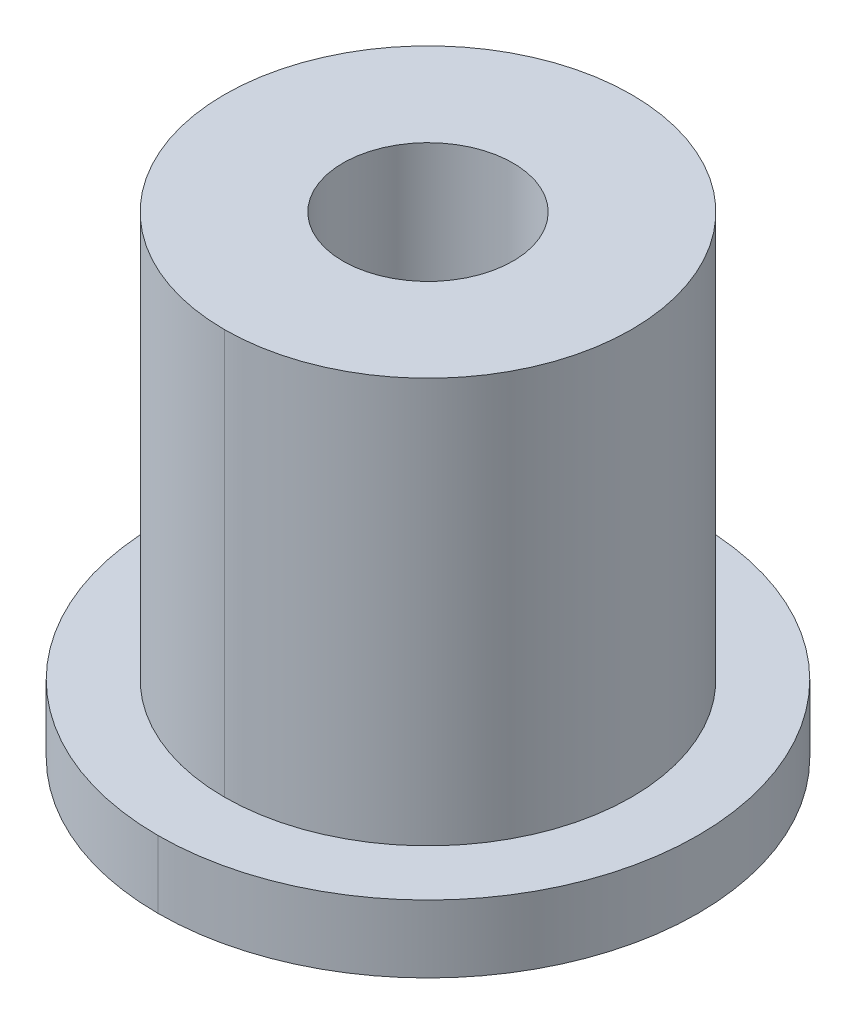
ISO-10303-21;
HEADER;
FILE_DESCRIPTION(('STEP AP214'),'2;1');
FILE_NAME('part.step','',(''),(''),'','','');
FILE_SCHEMA(('AUTOMOTIVE_DESIGN { 1 0 10303 214 1 1 1 1 }'));
ENDSEC;
DATA;
#1=APPLICATION_CONTEXT('core data for automotive mechanical design processes');
#2=APPLICATION_PROTOCOL_DEFINITION('international standard','automotive_design',2000,#1);
#3=PRODUCT_CONTEXT('',#1,'mechanical');
#4=PRODUCT('Part','Part','',(#3));
#5=PRODUCT_RELATED_PRODUCT_CATEGORY('part','',(#4));
#6=PRODUCT_DEFINITION_FORMATION('','',#4);
#7=PRODUCT_DEFINITION_CONTEXT('part definition',#1,'design');
#8=PRODUCT_DEFINITION('design','',#6,#7);
#9=PRODUCT_DEFINITION_SHAPE('','',#8);
#10=(LENGTH_UNIT() NAMED_UNIT(*) SI_UNIT(.MILLI.,.METRE.));
#11=(NAMED_UNIT(*) PLANE_ANGLE_UNIT() SI_UNIT($,.RADIAN.));
#12=(NAMED_UNIT(*) SI_UNIT($,.STERADIAN.) SOLID_ANGLE_UNIT());
#13=UNCERTAINTY_MEASURE_WITH_UNIT(LENGTH_MEASURE(1.E-05),#10,'distance_accuracy_value','');
#14=(GEOMETRIC_REPRESENTATION_CONTEXT(3) GLOBAL_UNCERTAINTY_ASSIGNED_CONTEXT((#13)) GLOBAL_UNIT_ASSIGNED_CONTEXT((#10,
#11,#12)) REPRESENTATION_CONTEXT('',''));
#15=CARTESIAN_POINT('',(0.,0.,0.));
#16=DIRECTION('',(0.,0.,1.));
#17=DIRECTION('',(1.,0.,0.));
#18=AXIS2_PLACEMENT_3D('',#15,#16,#17);
#19=CARTESIAN_POINT('',(0.,1.5875,0.));
#20=DIRECTION('',(0.,-1.,0.));
#21=DIRECTION('',(0.,0.,-1.));
#22=AXIS2_PLACEMENT_3D('',#19,#20,#21);
#23=CYLINDRICAL_SURFACE('',#22,6.35);
#24=DIRECTION('',(0.,-1.,0.));
#25=VECTOR('',#24,1.);
#26=CARTESIAN_POINT('',(0.,1.5875,6.35));
#27=LINE('',#26,#25);
#28=CARTESIAN_POINT('',(0.,1.5875,6.35));
#29=VERTEX_POINT('',#28);
#30=CARTESIAN_POINT('',(0.,0.,6.35));
#31=VERTEX_POINT('',#30);
#32=EDGE_CURVE('E143',#29,#31,#27,.T.);
#33=ORIENTED_EDGE('',*,*,#32,.F.);
#34=CARTESIAN_POINT('',(0.,1.5875,0.));
#35=DIRECTION('',(0.,1.,0.));
#36=DIRECTION('',(0.,0.,1.));
#37=AXIS2_PLACEMENT_3D('',#34,#35,#36);
#38=CIRCLE('',#37,6.35);
#39=CARTESIAN_POINT('',(0.,1.5875,-6.35));
#40=VERTEX_POINT('',#39);
#41=EDGE_CURVE('E11',#40,#29,#38,.T.);
#42=ORIENTED_EDGE('',*,*,#41,.F.);
#43=DIRECTION('',(0.,-1.,0.));
#44=VECTOR('',#43,1.);
#45=CARTESIAN_POINT('',(0.,1.5875,-6.35));
#46=LINE('',#45,#44);
#47=CARTESIAN_POINT('',(0.,0.,-6.35));
#48=VERTEX_POINT('',#47);
#49=EDGE_CURVE('E118',#40,#48,#46,.T.);
#50=ORIENTED_EDGE('',*,*,#49,.T.);
#51=CARTESIAN_POINT('',(0.,0.,0.));
#52=DIRECTION('',(0.,1.,0.));
#53=DIRECTION('',(0.,0.,1.));
#54=AXIS2_PLACEMENT_3D('',#51,#52,#53);
#55=CIRCLE('',#54,6.35);
#56=EDGE_CURVE('E107',#48,#31,#55,.T.);
#57=ORIENTED_EDGE('',*,*,#56,.T.);
#58=EDGE_LOOP('',(#33,#42,#50,#57));
#59=FACE_BOUND('',#58,.T.);
#60=ADVANCED_FACE('F51',(#59),#23,.T.);
#61=CARTESIAN_POINT('',(0.,1.5875,0.));
#62=DIRECTION('',(0.,1.,0.));
#63=DIRECTION('',(1.,0.,0.));
#64=AXIS2_PLACEMENT_3D('',#61,#62,#63);
#65=PLANE('',#64);
#66=CARTESIAN_POINT('',(0.,1.5875,0.));
#67=DIRECTION('',(0.,1.,0.));
#68=DIRECTION('',(0.,0.,1.));
#69=AXIS2_PLACEMENT_3D('',#66,#67,#68);
#70=CIRCLE('',#69,4.7879);
#71=CARTESIAN_POINT('',(0.,1.5875,-4.7879));
#72=VERTEX_POINT('',#71);
#73=CARTESIAN_POINT('',(0.,1.5875,4.7879));
#74=VERTEX_POINT('',#73);
#75=EDGE_CURVE('E61',#72,#74,#70,.T.);
#76=ORIENTED_EDGE('',*,*,#75,.F.);
#77=CARTESIAN_POINT('',(0.,1.5875,0.));
#78=DIRECTION('',(0.,1.,0.));
#79=DIRECTION('',(0.,0.,1.));
#80=AXIS2_PLACEMENT_3D('',#77,#78,#79);
#81=CIRCLE('',#80,4.7879);
#82=EDGE_CURVE('E112',#74,#72,#81,.T.);
#83=ORIENTED_EDGE('',*,*,#82,.F.);
#84=EDGE_LOOP('',(#76,#83));
#85=FACE_BOUND('',#84,.T.);
#86=ORIENTED_EDGE('',*,*,#41,.T.);
#87=CARTESIAN_POINT('',(0.,1.5875,0.));
#88=DIRECTION('',(0.,1.,0.));
#89=DIRECTION('',(0.,0.,1.));
#90=AXIS2_PLACEMENT_3D('',#87,#88,#89);
#91=CIRCLE('',#90,6.35);
#92=EDGE_CURVE('E139',#29,#40,#91,.T.);
#93=ORIENTED_EDGE('',*,*,#92,.T.);
#94=EDGE_LOOP('',(#86,#93));
#95=FACE_BOUND('',#94,.T.);
#96=ADVANCED_FACE('F53',(#85,#95),#65,.T.);
#97=CARTESIAN_POINT('',(0.,11.1125,0.));
#98=DIRECTION('',(0.,-1.,0.));
#99=DIRECTION('',(0.,0.,-1.));
#100=AXIS2_PLACEMENT_3D('',#97,#98,#99);
#101=CYLINDRICAL_SURFACE('',#100,4.7879);
#102=DIRECTION('',(0.,-1.,0.));
#103=VECTOR('',#102,1.);
#104=CARTESIAN_POINT('',(0.,11.1125,4.7879));
#105=LINE('',#104,#103);
#106=CARTESIAN_POINT('',(0.,11.1125,4.7879));
#107=VERTEX_POINT('',#106);
#108=EDGE_CURVE('E102',#107,#74,#105,.T.);
#109=ORIENTED_EDGE('',*,*,#108,.F.);
#110=CARTESIAN_POINT('',(0.,11.1125,0.));
#111=DIRECTION('',(0.,1.,0.));
#112=DIRECTION('',(0.,0.,1.));
#113=AXIS2_PLACEMENT_3D('',#110,#111,#112);
#114=CIRCLE('',#113,4.7879);
#115=CARTESIAN_POINT('',(0.,11.1125,-4.7879));
#116=VERTEX_POINT('',#115);
#117=EDGE_CURVE('E96',#116,#107,#114,.T.);
#118=ORIENTED_EDGE('',*,*,#117,.F.);
#119=DIRECTION('',(0.,-1.,0.));
#120=VECTOR('',#119,1.);
#121=CARTESIAN_POINT('',(0.,11.1125,-4.7879));
#122=LINE('',#121,#120);
#123=EDGE_CURVE('E99',#116,#72,#122,.T.);
#124=ORIENTED_EDGE('',*,*,#123,.T.);
#125=ORIENTED_EDGE('',*,*,#75,.T.);
#126=EDGE_LOOP('',(#109,#118,#124,#125));
#127=FACE_BOUND('',#126,.T.);
#128=ADVANCED_FACE('F98',(#127),#101,.T.);
#129=CARTESIAN_POINT('',(0.,0.,0.));
#130=DIRECTION('',(0.,1.,0.));
#131=DIRECTION('',(1.,0.,0.));
#132=AXIS2_PLACEMENT_3D('',#129,#130,#131);
#133=PLANE('',#132);
#134=ORIENTED_EDGE('',*,*,#56,.F.);
#135=CARTESIAN_POINT('',(0.,0.,0.));
#136=DIRECTION('',(0.,1.,0.));
#137=DIRECTION('',(0.,0.,1.));
#138=AXIS2_PLACEMENT_3D('',#135,#136,#137);
#139=CIRCLE('',#138,6.35);
#140=EDGE_CURVE('E125',#31,#48,#139,.T.);
#141=ORIENTED_EDGE('',*,*,#140,.F.);
#142=EDGE_LOOP('',(#134,#141));
#143=FACE_BOUND('',#142,.T.);
#144=CARTESIAN_POINT('',(0.,0.,0.));
#145=DIRECTION('',(0.,1.,0.));
#146=DIRECTION('',(0.,0.,1.));
#147=AXIS2_PLACEMENT_3D('',#144,#145,#146);
#148=CIRCLE('',#147,2.);
#149=CARTESIAN_POINT('',(0.,0.,2.));
#150=VERTEX_POINT('',#149);
#151=EDGE_CURVE('E151',#150,#150,#148,.T.);
#152=ORIENTED_EDGE('',*,*,#151,.T.);
#153=EDGE_LOOP('',(#152));
#154=FACE_BOUND('',#153,.T.);
#155=ADVANCED_FACE('F163',(#143,#154),#133,.F.);
#156=CARTESIAN_POINT('',(0.,11.1125,0.));
#157=DIRECTION('',(0.,1.,0.));
#158=DIRECTION('',(1.,0.,0.));
#159=AXIS2_PLACEMENT_3D('',#156,#157,#158);
#160=PLANE('',#159);
#161=ORIENTED_EDGE('',*,*,#117,.T.);
#162=CARTESIAN_POINT('',(0.,11.1125,0.));
#163=DIRECTION('',(0.,1.,0.));
#164=DIRECTION('',(0.,0.,1.));
#165=AXIS2_PLACEMENT_3D('',#162,#163,#164);
#166=CIRCLE('',#165,4.7879);
#167=EDGE_CURVE('E111',#107,#116,#166,.T.);
#168=ORIENTED_EDGE('',*,*,#167,.T.);
#169=EDGE_LOOP('',(#161,#168));
#170=FACE_BOUND('',#169,.T.);
#171=CARTESIAN_POINT('',(0.,11.1125,0.));
#172=DIRECTION('',(0.,1.,0.));
#173=DIRECTION('',(0.,0.,1.));
#174=AXIS2_PLACEMENT_3D('',#171,#172,#173);
#175=CIRCLE('',#174,2.);
#176=CARTESIAN_POINT('',(0.,11.1125,2.));
#177=VERTEX_POINT('',#176);
#178=EDGE_CURVE('E156',#177,#177,#175,.T.);
#179=ORIENTED_EDGE('',*,*,#178,.F.);
#180=EDGE_LOOP('',(#179));
#181=FACE_BOUND('',#180,.T.);
#182=ADVANCED_FACE('F115',(#170,#181),#160,.T.);
#183=CARTESIAN_POINT('',(0.,11.1125,0.));
#184=DIRECTION('',(0.,-1.,0.));
#185=DIRECTION('',(0.,0.,-1.));
#186=AXIS2_PLACEMENT_3D('',#183,#184,#185);
#187=CYLINDRICAL_SURFACE('',#186,4.7879);
#188=ORIENTED_EDGE('',*,*,#167,.F.);
#189=ORIENTED_EDGE('',*,*,#108,.T.);
#190=ORIENTED_EDGE('',*,*,#82,.T.);
#191=ORIENTED_EDGE('',*,*,#123,.F.);
#192=EDGE_LOOP('',(#188,#189,#190,#191));
#193=FACE_BOUND('',#192,.T.);
#194=ADVANCED_FACE('F110',(#193),#187,.T.);
#195=CARTESIAN_POINT('',(0.,1.5875,0.));
#196=DIRECTION('',(0.,-1.,0.));
#197=DIRECTION('',(0.,0.,-1.));
#198=AXIS2_PLACEMENT_3D('',#195,#196,#197);
#199=CYLINDRICAL_SURFACE('',#198,6.35);
#200=ORIENTED_EDGE('',*,*,#92,.F.);
#201=ORIENTED_EDGE('',*,*,#32,.T.);
#202=ORIENTED_EDGE('',*,*,#140,.T.);
#203=ORIENTED_EDGE('',*,*,#49,.F.);
#204=EDGE_LOOP('',(#200,#201,#202,#203));
#205=FACE_BOUND('',#204,.T.);
#206=ADVANCED_FACE('F149',(#205),#199,.T.);
#207=CARTESIAN_POINT('',(0.,0.,0.));
#208=DIRECTION('',(0.,1.,0.));
#209=DIRECTION('',(0.,0.,1.));
#210=AXIS2_PLACEMENT_3D('',#207,#208,#209);
#211=CYLINDRICAL_SURFACE('',#210,2.);
#212=ORIENTED_EDGE('',*,*,#151,.F.);
#213=EDGE_LOOP('',(#212));
#214=FACE_BOUND('',#213,.T.);
#215=ORIENTED_EDGE('',*,*,#178,.T.);
#216=EDGE_LOOP('',(#215));
#217=FACE_BOUND('',#216,.T.);
#218=ADVANCED_FACE('F264',(#214,#217),#211,.F.);
#219=CLOSED_SHELL('',(#60,#96,#128,#155,#182,#194,#206,#218));
#220=MANIFOLD_SOLID_BREP('B2',#219);
#221=ADVANCED_BREP_SHAPE_REPRESENTATION('',(#18,#220),#14);
#222=SHAPE_DEFINITION_REPRESENTATION(#9,#221);
ENDSEC;
END-ISO-10303-21;
